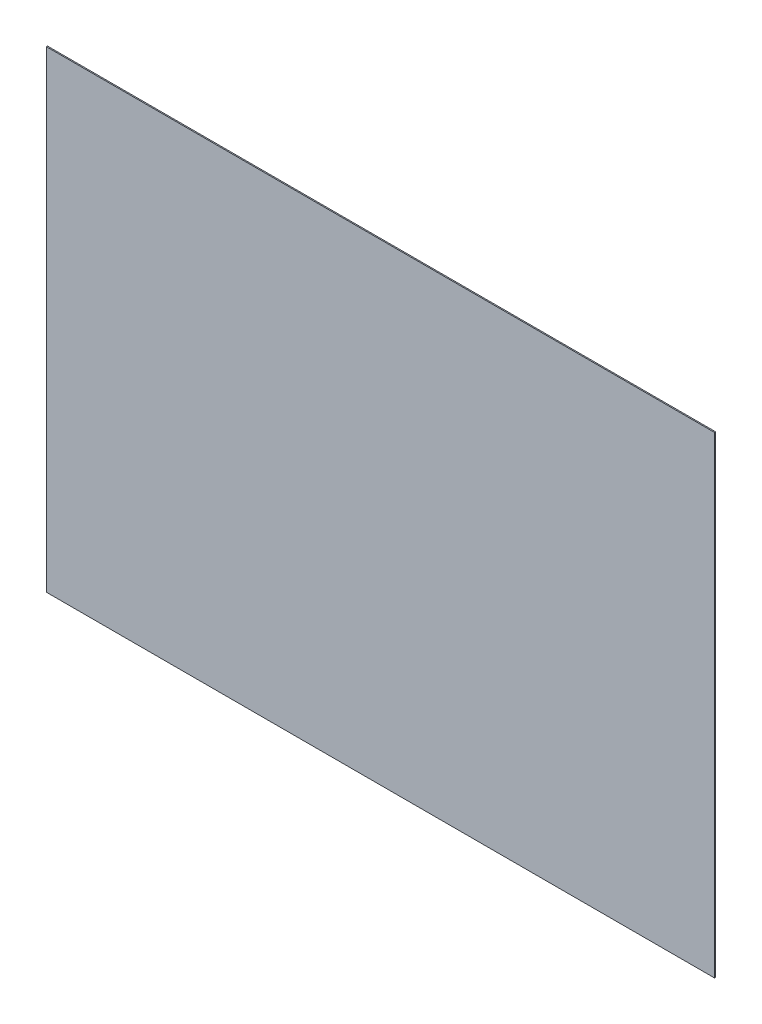
ISO-10303-21;
HEADER;
FILE_DESCRIPTION(('STEP AP214'),'2;1');
FILE_NAME('part.step','',(''),(''),'','','');
FILE_SCHEMA(('AUTOMOTIVE_DESIGN { 1 0 10303 214 1 1 1 1 }'));
ENDSEC;
DATA;
#1=APPLICATION_CONTEXT('core data for automotive mechanical design processes');
#2=APPLICATION_PROTOCOL_DEFINITION('international standard','automotive_design',2000,#1);
#3=PRODUCT_CONTEXT('',#1,'mechanical');
#4=PRODUCT('Part','Part','',(#3));
#5=PRODUCT_RELATED_PRODUCT_CATEGORY('part','',(#4));
#6=PRODUCT_DEFINITION_FORMATION('','',#4);
#7=PRODUCT_DEFINITION_CONTEXT('part definition',#1,'design');
#8=PRODUCT_DEFINITION('design','',#6,#7);
#9=PRODUCT_DEFINITION_SHAPE('','',#8);
#10=(LENGTH_UNIT() NAMED_UNIT(*) SI_UNIT(.MILLI.,.METRE.));
#11=(NAMED_UNIT(*) PLANE_ANGLE_UNIT() SI_UNIT($,.RADIAN.));
#12=(NAMED_UNIT(*) SI_UNIT($,.STERADIAN.) SOLID_ANGLE_UNIT());
#13=UNCERTAINTY_MEASURE_WITH_UNIT(LENGTH_MEASURE(1.E-05),#10,'distance_accuracy_value','');
#14=(GEOMETRIC_REPRESENTATION_CONTEXT(3) GLOBAL_UNCERTAINTY_ASSIGNED_CONTEXT((#13)) GLOBAL_UNIT_ASSIGNED_CONTEXT((#10,
#11,#12)) REPRESENTATION_CONTEXT('',''));
#15=CARTESIAN_POINT('',(0.,0.,0.));
#16=DIRECTION('',(0.,0.,1.));
#17=DIRECTION('',(1.,0.,0.));
#18=AXIS2_PLACEMENT_3D('',#15,#16,#17);
#19=CARTESIAN_POINT('',(0.,0.,0.5));
#20=DIRECTION('',(1.,0.,0.));
#21=DIRECTION('',(0.,0.,-1.));
#22=AXIS2_PLACEMENT_3D('',#19,#20,#21);
#23=PLANE('',#22);
#24=DIRECTION('',(0.,-1.,0.));
#25=VECTOR('',#24,1.);
#26=CARTESIAN_POINT('',(0.,0.,0.));
#27=LINE('',#26,#25);
#28=CARTESIAN_POINT('',(0.,210.,0.));
#29=VERTEX_POINT('',#28);
#30=CARTESIAN_POINT('',(0.,0.,0.));
#31=VERTEX_POINT('',#30);
#32=EDGE_CURVE('E97',#29,#31,#27,.T.);
#33=ORIENTED_EDGE('',*,*,#32,.T.);
#34=DIRECTION('',(0.,0.,-1.));
#35=VECTOR('',#34,1.);
#36=CARTESIAN_POINT('',(0.,0.,0.5));
#37=LINE('',#36,#35);
#38=CARTESIAN_POINT('',(0.,0.,0.5));
#39=VERTEX_POINT('',#38);
#40=EDGE_CURVE('E11',#39,#31,#37,.T.);
#41=ORIENTED_EDGE('',*,*,#40,.F.);
#42=DIRECTION('',(0.,-1.,0.));
#43=VECTOR('',#42,1.);
#44=CARTESIAN_POINT('',(0.,0.,0.5));
#45=LINE('',#44,#43);
#46=CARTESIAN_POINT('',(0.,210.,0.5));
#47=VERTEX_POINT('',#46);
#48=EDGE_CURVE('E85',#47,#39,#45,.T.);
#49=ORIENTED_EDGE('',*,*,#48,.F.);
#50=DIRECTION('',(0.,0.,-1.));
#51=VECTOR('',#50,1.);
#52=CARTESIAN_POINT('',(0.,210.,0.5));
#53=LINE('',#52,#51);
#54=EDGE_CURVE('E93',#47,#29,#53,.T.);
#55=ORIENTED_EDGE('',*,*,#54,.T.);
#56=EDGE_LOOP('',(#33,#41,#49,#55));
#57=FACE_BOUND('',#56,.T.);
#58=ADVANCED_FACE('F34',(#57),#23,.F.);
#59=CARTESIAN_POINT('',(0.,0.,0.5));
#60=DIRECTION('',(0.,1.,0.));
#61=DIRECTION('',(0.,0.,1.));
#62=AXIS2_PLACEMENT_3D('',#59,#60,#61);
#63=PLANE('',#62);
#64=DIRECTION('',(1.,0.,0.));
#65=VECTOR('',#64,1.);
#66=CARTESIAN_POINT('',(0.,0.,0.));
#67=LINE('',#66,#65);
#68=CARTESIAN_POINT('',(297.,0.,0.));
#69=VERTEX_POINT('',#68);
#70=EDGE_CURVE('E89',#31,#69,#67,.T.);
#71=ORIENTED_EDGE('',*,*,#70,.T.);
#72=DIRECTION('',(0.,0.,-1.));
#73=VECTOR('',#72,1.);
#74=CARTESIAN_POINT('',(297.,0.,0.5));
#75=LINE('',#74,#73);
#76=CARTESIAN_POINT('',(297.,0.,0.5));
#77=VERTEX_POINT('',#76);
#78=EDGE_CURVE('E42',#77,#69,#75,.T.);
#79=ORIENTED_EDGE('',*,*,#78,.F.);
#80=DIRECTION('',(1.,0.,0.));
#81=VECTOR('',#80,1.);
#82=CARTESIAN_POINT('',(0.,0.,0.5));
#83=LINE('',#82,#81);
#84=EDGE_CURVE('E80',#39,#77,#83,.T.);
#85=ORIENTED_EDGE('',*,*,#84,.F.);
#86=ORIENTED_EDGE('',*,*,#40,.T.);
#87=EDGE_LOOP('',(#71,#79,#85,#86));
#88=FACE_BOUND('',#87,.T.);
#89=ADVANCED_FACE('F88',(#88),#63,.F.);
#90=CARTESIAN_POINT('',(297.,0.,0.5));
#91=DIRECTION('',(-1.,0.,0.));
#92=DIRECTION('',(0.,0.,1.));
#93=AXIS2_PLACEMENT_3D('',#90,#91,#92);
#94=PLANE('',#93);
#95=DIRECTION('',(0.,1.,0.));
#96=VECTOR('',#95,1.);
#97=CARTESIAN_POINT('',(297.,0.,0.));
#98=LINE('',#97,#96);
#99=CARTESIAN_POINT('',(297.,210.,0.));
#100=VERTEX_POINT('',#99);
#101=EDGE_CURVE('E67',#69,#100,#98,.T.);
#102=ORIENTED_EDGE('',*,*,#101,.T.);
#103=DIRECTION('',(0.,0.,-1.));
#104=VECTOR('',#103,1.);
#105=CARTESIAN_POINT('',(297.,210.,0.5));
#106=LINE('',#105,#104);
#107=CARTESIAN_POINT('',(297.,210.,0.5));
#108=VERTEX_POINT('',#107);
#109=EDGE_CURVE('E90',#108,#100,#106,.T.);
#110=ORIENTED_EDGE('',*,*,#109,.F.);
#111=DIRECTION('',(0.,1.,0.));
#112=VECTOR('',#111,1.);
#113=CARTESIAN_POINT('',(297.,0.,0.5));
#114=LINE('',#113,#112);
#115=EDGE_CURVE('E83',#77,#108,#114,.T.);
#116=ORIENTED_EDGE('',*,*,#115,.F.);
#117=ORIENTED_EDGE('',*,*,#78,.T.);
#118=EDGE_LOOP('',(#102,#110,#116,#117));
#119=FACE_BOUND('',#118,.T.);
#120=ADVANCED_FACE('F91',(#119),#94,.F.);
#121=CARTESIAN_POINT('',(0.,210.,0.5));
#122=DIRECTION('',(0.,-1.,0.));
#123=DIRECTION('',(0.,0.,-1.));
#124=AXIS2_PLACEMENT_3D('',#121,#122,#123);
#125=PLANE('',#124);
#126=DIRECTION('',(-1.,0.,0.));
#127=VECTOR('',#126,1.);
#128=CARTESIAN_POINT('',(0.,210.,0.));
#129=LINE('',#128,#127);
#130=EDGE_CURVE('E73',#100,#29,#129,.T.);
#131=ORIENTED_EDGE('',*,*,#130,.T.);
#132=ORIENTED_EDGE('',*,*,#54,.F.);
#133=DIRECTION('',(-1.,0.,0.));
#134=VECTOR('',#133,1.);
#135=CARTESIAN_POINT('',(0.,210.,0.5));
#136=LINE('',#135,#134);
#137=EDGE_CURVE('E50',#108,#47,#136,.T.);
#138=ORIENTED_EDGE('',*,*,#137,.F.);
#139=ORIENTED_EDGE('',*,*,#109,.T.);
#140=EDGE_LOOP('',(#131,#132,#138,#139));
#141=FACE_BOUND('',#140,.T.);
#142=ADVANCED_FACE('F104',(#141),#125,.F.);
#143=CARTESIAN_POINT('',(0.,0.,0.5));
#144=DIRECTION('',(0.,0.,-1.));
#145=DIRECTION('',(-1.,0.,0.));
#146=AXIS2_PLACEMENT_3D('',#143,#144,#145);
#147=PLANE('',#146);
#148=ORIENTED_EDGE('',*,*,#48,.T.);
#149=ORIENTED_EDGE('',*,*,#84,.T.);
#150=ORIENTED_EDGE('',*,*,#115,.T.);
#151=ORIENTED_EDGE('',*,*,#137,.T.);
#152=EDGE_LOOP('',(#148,#149,#150,#151));
#153=FACE_BOUND('',#152,.T.);
#154=ADVANCED_FACE('F81',(#153),#147,.F.);
#155=CARTESIAN_POINT('',(0.,0.,0.));
#156=DIRECTION('',(0.,0.,-1.));
#157=DIRECTION('',(-1.,0.,0.));
#158=AXIS2_PLACEMENT_3D('',#155,#156,#157);
#159=PLANE('',#158);
#160=ORIENTED_EDGE('',*,*,#32,.F.);
#161=ORIENTED_EDGE('',*,*,#130,.F.);
#162=ORIENTED_EDGE('',*,*,#101,.F.);
#163=ORIENTED_EDGE('',*,*,#70,.F.);
#164=EDGE_LOOP('',(#160,#161,#162,#163));
#165=FACE_BOUND('',#164,.T.);
#166=ADVANCED_FACE('F107',(#165),#159,.T.);
#167=CLOSED_SHELL('',(#58,#89,#120,#142,#154,#166));
#168=MANIFOLD_SOLID_BREP('B2',#167);
#169=ADVANCED_BREP_SHAPE_REPRESENTATION('',(#18,#168),#14);
#170=SHAPE_DEFINITION_REPRESENTATION(#9,#169);
ENDSEC;
END-ISO-10303-21;
